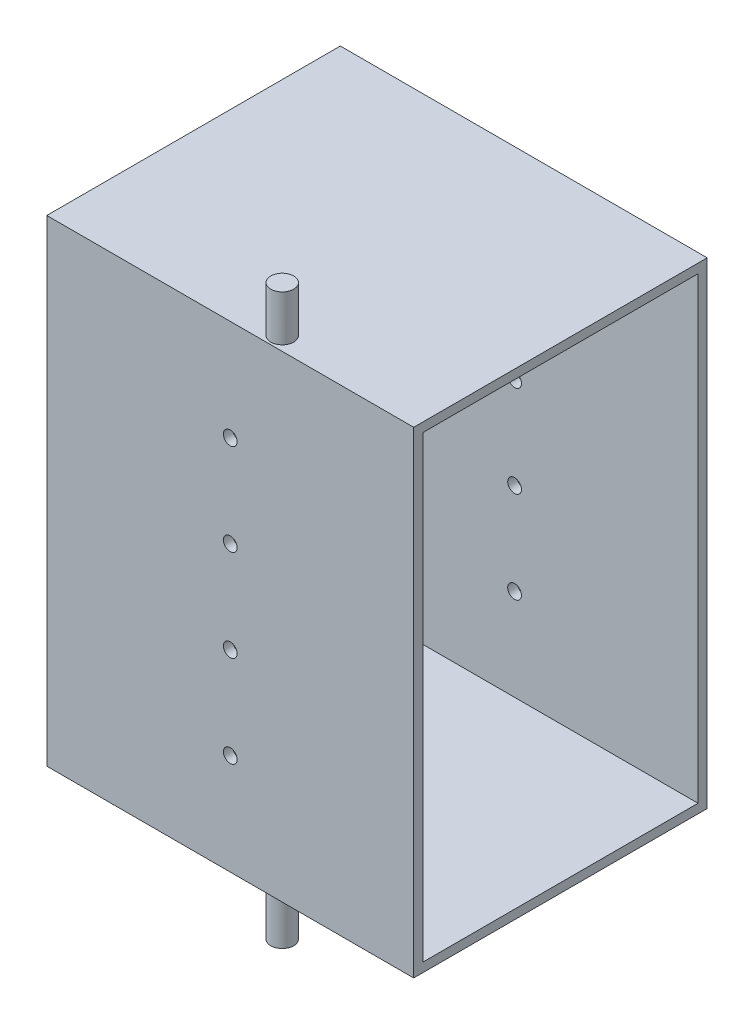
ISO-10303-21;
HEADER;
FILE_DESCRIPTION(('STEP AP214'),'2;1');
FILE_NAME('part.step','',(''),(''),'','','');
FILE_SCHEMA(('AUTOMOTIVE_DESIGN { 1 0 10303 214 1 1 1 1 }'));
ENDSEC;
DATA;
#1=APPLICATION_CONTEXT('core data for automotive mechanical design processes');
#2=APPLICATION_PROTOCOL_DEFINITION('international standard','automotive_design',2000,#1);
#3=PRODUCT_CONTEXT('',#1,'mechanical');
#4=PRODUCT('Part','Part','',(#3));
#5=PRODUCT_RELATED_PRODUCT_CATEGORY('part','',(#4));
#6=PRODUCT_DEFINITION_FORMATION('','',#4);
#7=PRODUCT_DEFINITION_CONTEXT('part definition',#1,'design');
#8=PRODUCT_DEFINITION('design','',#6,#7);
#9=PRODUCT_DEFINITION_SHAPE('','',#8);
#10=(LENGTH_UNIT() NAMED_UNIT(*) SI_UNIT(.MILLI.,.METRE.));
#11=(NAMED_UNIT(*) PLANE_ANGLE_UNIT() SI_UNIT($,.RADIAN.));
#12=(NAMED_UNIT(*) SI_UNIT($,.STERADIAN.) SOLID_ANGLE_UNIT());
#13=UNCERTAINTY_MEASURE_WITH_UNIT(LENGTH_MEASURE(1.E-05),#10,'distance_accuracy_value','');
#14=(GEOMETRIC_REPRESENTATION_CONTEXT(3) GLOBAL_UNCERTAINTY_ASSIGNED_CONTEXT((#13)) GLOBAL_UNIT_ASSIGNED_CONTEXT((#10,
#11,#12)) REPRESENTATION_CONTEXT('',''));
#15=CARTESIAN_POINT('',(0.,0.,0.));
#16=DIRECTION('',(0.,0.,1.));
#17=DIRECTION('',(1.,0.,0.));
#18=AXIS2_PLACEMENT_3D('',#15,#16,#17);
#19=CARTESIAN_POINT('',(98.,90.,32.));
#20=DIRECTION('',(0.,0.,-1.));
#21=DIRECTION('',(-1.,0.,0.));
#22=AXIS2_PLACEMENT_3D('',#19,#20,#21);
#23=PLANE('',#22);
#24=CARTESIAN_POINT('',(58.,110.,32.));
#25=DIRECTION('',(0.,0.,1.));
#26=DIRECTION('',(1.,0.,0.));
#27=AXIS2_PLACEMENT_3D('',#24,#25,#26);
#28=CIRCLE('',#27,1.5);
#29=CARTESIAN_POINT('',(59.5,110.,32.));
#30=VERTEX_POINT('',#29);
#31=EDGE_CURVE('E293',#30,#30,#28,.T.);
#32=ORIENTED_EDGE('',*,*,#31,.F.);
#33=EDGE_LOOP('',(#32));
#34=FACE_BOUND('',#33,.T.);
#35=CARTESIAN_POINT('',(58.,130.,32.));
#36=DIRECTION('',(0.,0.,1.));
#37=DIRECTION('',(1.,0.,0.));
#38=AXIS2_PLACEMENT_3D('',#35,#36,#37);
#39=CIRCLE('',#38,1.5);
#40=CARTESIAN_POINT('',(59.5,130.,32.));
#41=VERTEX_POINT('',#40);
#42=EDGE_CURVE('E296',#41,#41,#39,.T.);
#43=ORIENTED_EDGE('',*,*,#42,.F.);
#44=EDGE_LOOP('',(#43));
#45=FACE_BOUND('',#44,.T.);
#46=CARTESIAN_POINT('',(58.,150.,32.));
#47=DIRECTION('',(0.,0.,1.));
#48=DIRECTION('',(1.,0.,0.));
#49=AXIS2_PLACEMENT_3D('',#46,#47,#48);
#50=CIRCLE('',#49,1.5);
#51=CARTESIAN_POINT('',(59.5,150.,32.));
#52=VERTEX_POINT('',#51);
#53=EDGE_CURVE('E301',#52,#52,#50,.T.);
#54=ORIENTED_EDGE('',*,*,#53,.F.);
#55=EDGE_LOOP('',(#54));
#56=FACE_BOUND('',#55,.T.);
#57=CARTESIAN_POINT('',(58.,170.,32.));
#58=DIRECTION('',(0.,0.,1.));
#59=DIRECTION('',(1.,0.,0.));
#60=AXIS2_PLACEMENT_3D('',#57,#58,#59);
#61=CIRCLE('',#60,1.5);
#62=CARTESIAN_POINT('',(59.5,170.,32.));
#63=VERTEX_POINT('',#62);
#64=EDGE_CURVE('E307',#63,#63,#61,.T.);
#65=ORIENTED_EDGE('',*,*,#64,.F.);
#66=EDGE_LOOP('',(#65));
#67=FACE_BOUND('',#66,.T.);
#68=DIRECTION('',(0.,-1.,0.));
#69=VECTOR('',#68,1.);
#70=CARTESIAN_POINT('',(18.,90.,32.));
#71=LINE('',#70,#69);
#72=CARTESIAN_POINT('',(18.,192.,32.));
#73=VERTEX_POINT('',#72);
#74=CARTESIAN_POINT('',(18.,88.,32.));
#75=VERTEX_POINT('',#74);
#76=EDGE_CURVE('E123',#73,#75,#71,.T.);
#77=ORIENTED_EDGE('',*,*,#76,.T.);
#78=DIRECTION('',(-1.,0.,0.));
#79=VECTOR('',#78,1.);
#80=CARTESIAN_POINT('',(98.,88.,32.));
#81=LINE('',#80,#79);
#82=CARTESIAN_POINT('',(98.,88.,32.));
#83=VERTEX_POINT('',#82);
#84=EDGE_CURVE('E146',#83,#75,#81,.T.);
#85=ORIENTED_EDGE('',*,*,#84,.F.);
#86=DIRECTION('',(0.,-1.,0.));
#87=VECTOR('',#86,1.);
#88=CARTESIAN_POINT('',(98.,90.,32.));
#89=LINE('',#88,#87);
#90=CARTESIAN_POINT('',(98.,192.,32.));
#91=VERTEX_POINT('',#90);
#92=EDGE_CURVE('E164',#91,#83,#89,.T.);
#93=ORIENTED_EDGE('',*,*,#92,.F.);
#94=DIRECTION('',(-1.,0.,0.));
#95=VECTOR('',#94,1.);
#96=CARTESIAN_POINT('',(98.,192.,32.));
#97=LINE('',#96,#95);
#98=EDGE_CURVE('E150',#91,#73,#97,.T.);
#99=ORIENTED_EDGE('',*,*,#98,.T.);
#100=EDGE_LOOP('',(#77,#85,#93,#99));
#101=FACE_BOUND('',#100,.T.);
#102=ADVANCED_FACE('F39',(#34,#45,#56,#67,#101),#23,.F.);
#103=CARTESIAN_POINT('',(98.,88.,-30.));
#104=DIRECTION('',(0.,1.,0.));
#105=DIRECTION('',(0.,0.,1.));
#106=AXIS2_PLACEMENT_3D('',#103,#104,#105);
#107=PLANE('',#106);
#108=CARTESIAN_POINT('',(66.3422751481595,88.,29.));
#109=DIRECTION('',(0.,1.,0.));
#110=DIRECTION('',(0.,0.,1.));
#111=AXIS2_PLACEMENT_3D('',#108,#109,#110);
#112=CIRCLE('',#111,2.5);
#113=CARTESIAN_POINT('',(66.3422751481595,88.,31.5));
#114=VERTEX_POINT('',#113);
#115=EDGE_CURVE('E11',#114,#114,#112,.F.);
#116=ORIENTED_EDGE('',*,*,#115,.F.);
#117=EDGE_LOOP('',(#116));
#118=FACE_BOUND('',#117,.T.);
#119=DIRECTION('',(0.,0.,-1.));
#120=VECTOR('',#119,1.);
#121=CARTESIAN_POINT('',(18.,88.,-30.));
#122=LINE('',#121,#120);
#123=CARTESIAN_POINT('',(18.,88.,-32.));
#124=VERTEX_POINT('',#123);
#125=EDGE_CURVE('E161',#75,#124,#122,.T.);
#126=ORIENTED_EDGE('',*,*,#125,.T.);
#127=DIRECTION('',(-1.,0.,0.));
#128=VECTOR('',#127,1.);
#129=CARTESIAN_POINT('',(98.,88.,-32.));
#130=LINE('',#129,#128);
#131=CARTESIAN_POINT('',(98.,88.,-32.));
#132=VERTEX_POINT('',#131);
#133=EDGE_CURVE('E149',#132,#124,#130,.T.);
#134=ORIENTED_EDGE('',*,*,#133,.F.);
#135=DIRECTION('',(0.,0.,-1.));
#136=VECTOR('',#135,1.);
#137=CARTESIAN_POINT('',(98.,88.,-30.));
#138=LINE('',#137,#136);
#139=EDGE_CURVE('E170',#83,#132,#138,.T.);
#140=ORIENTED_EDGE('',*,*,#139,.F.);
#141=ORIENTED_EDGE('',*,*,#84,.T.);
#142=EDGE_LOOP('',(#126,#134,#140,#141));
#143=FACE_BOUND('',#142,.T.);
#144=ADVANCED_FACE('F211',(#118,#143),#107,.F.);
#145=CARTESIAN_POINT('',(98.,90.,-32.));
#146=DIRECTION('',(0.,0.,1.));
#147=DIRECTION('',(1.,0.,0.));
#148=AXIS2_PLACEMENT_3D('',#145,#146,#147);
#149=PLANE('',#148);
#150=CARTESIAN_POINT('',(58.,110.,-32.));
#151=DIRECTION('',(0.,0.,1.));
#152=DIRECTION('',(1.,0.,0.));
#153=AXIS2_PLACEMENT_3D('',#150,#151,#152);
#154=CIRCLE('',#153,1.5);
#155=CARTESIAN_POINT('',(59.5,110.,-32.));
#156=VERTEX_POINT('',#155);
#157=EDGE_CURVE('E179',#156,#156,#154,.T.);
#158=ORIENTED_EDGE('',*,*,#157,.T.);
#159=EDGE_LOOP('',(#158));
#160=FACE_BOUND('',#159,.T.);
#161=CARTESIAN_POINT('',(58.,130.,-32.));
#162=DIRECTION('',(0.,0.,1.));
#163=DIRECTION('',(1.,0.,0.));
#164=AXIS2_PLACEMENT_3D('',#161,#162,#163);
#165=CIRCLE('',#164,1.5);
#166=CARTESIAN_POINT('',(59.5,130.,-32.));
#167=VERTEX_POINT('',#166);
#168=EDGE_CURVE('E298',#167,#167,#165,.T.);
#169=ORIENTED_EDGE('',*,*,#168,.T.);
#170=EDGE_LOOP('',(#169));
#171=FACE_BOUND('',#170,.T.);
#172=CARTESIAN_POINT('',(58.,150.,-32.));
#173=DIRECTION('',(0.,0.,1.));
#174=DIRECTION('',(1.,0.,0.));
#175=AXIS2_PLACEMENT_3D('',#172,#173,#174);
#176=CIRCLE('',#175,1.5);
#177=CARTESIAN_POINT('',(59.5,150.,-32.));
#178=VERTEX_POINT('',#177);
#179=EDGE_CURVE('E304',#178,#178,#176,.T.);
#180=ORIENTED_EDGE('',*,*,#179,.T.);
#181=EDGE_LOOP('',(#180));
#182=FACE_BOUND('',#181,.T.);
#183=CARTESIAN_POINT('',(58.,170.,-32.));
#184=DIRECTION('',(0.,0.,1.));
#185=DIRECTION('',(1.,0.,0.));
#186=AXIS2_PLACEMENT_3D('',#183,#184,#185);
#187=CIRCLE('',#186,1.5);
#188=CARTESIAN_POINT('',(59.5,170.,-32.));
#189=VERTEX_POINT('',#188);
#190=EDGE_CURVE('E290',#189,#189,#187,.T.);
#191=ORIENTED_EDGE('',*,*,#190,.T.);
#192=EDGE_LOOP('',(#191));
#193=FACE_BOUND('',#192,.T.);
#194=DIRECTION('',(0.,1.,0.));
#195=VECTOR('',#194,1.);
#196=CARTESIAN_POINT('',(18.,90.,-32.));
#197=LINE('',#196,#195);
#198=CARTESIAN_POINT('',(18.,192.,-32.));
#199=VERTEX_POINT('',#198);
#200=EDGE_CURVE('E165',#124,#199,#197,.T.);
#201=ORIENTED_EDGE('',*,*,#200,.T.);
#202=DIRECTION('',(-1.,0.,0.));
#203=VECTOR('',#202,1.);
#204=CARTESIAN_POINT('',(98.,192.,-32.));
#205=LINE('',#204,#203);
#206=CARTESIAN_POINT('',(98.,192.,-32.));
#207=VERTEX_POINT('',#206);
#208=EDGE_CURVE('E153',#207,#199,#205,.T.);
#209=ORIENTED_EDGE('',*,*,#208,.F.);
#210=DIRECTION('',(0.,1.,0.));
#211=VECTOR('',#210,1.);
#212=CARTESIAN_POINT('',(98.,90.,-32.));
#213=LINE('',#212,#211);
#214=EDGE_CURVE('E172',#132,#207,#213,.T.);
#215=ORIENTED_EDGE('',*,*,#214,.F.);
#216=ORIENTED_EDGE('',*,*,#133,.T.);
#217=EDGE_LOOP('',(#201,#209,#215,#216));
#218=FACE_BOUND('',#217,.T.);
#219=ADVANCED_FACE('F197',(#160,#171,#182,#193,#218),#149,.F.);
#220=CARTESIAN_POINT('',(98.,192.,-30.));
#221=DIRECTION('',(0.,-1.,0.));
#222=DIRECTION('',(0.,0.,-1.));
#223=AXIS2_PLACEMENT_3D('',#220,#221,#222);
#224=PLANE('',#223);
#225=CARTESIAN_POINT('',(66.3422751481595,192.,29.));
#226=DIRECTION('',(0.,-1.,0.));
#227=DIRECTION('',(0.,0.,-1.));
#228=AXIS2_PLACEMENT_3D('',#225,#226,#227);
#229=CIRCLE('',#228,2.5);
#230=CARTESIAN_POINT('',(66.3422751481595,192.,26.5));
#231=VERTEX_POINT('',#230);
#232=EDGE_CURVE('E47',#231,#231,#229,.F.);
#233=ORIENTED_EDGE('',*,*,#232,.F.);
#234=EDGE_LOOP('',(#233));
#235=FACE_BOUND('',#234,.T.);
#236=DIRECTION('',(0.,0.,1.));
#237=VECTOR('',#236,1.);
#238=CARTESIAN_POINT('',(18.,192.,-30.));
#239=LINE('',#238,#237);
#240=EDGE_CURVE('E162',#199,#73,#239,.T.);
#241=ORIENTED_EDGE('',*,*,#240,.T.);
#242=ORIENTED_EDGE('',*,*,#98,.F.);
#243=DIRECTION('',(0.,0.,1.));
#244=VECTOR('',#243,1.);
#245=CARTESIAN_POINT('',(98.,192.,-30.));
#246=LINE('',#245,#244);
#247=EDGE_CURVE('E154',#207,#91,#246,.T.);
#248=ORIENTED_EDGE('',*,*,#247,.F.);
#249=ORIENTED_EDGE('',*,*,#208,.T.);
#250=EDGE_LOOP('',(#241,#242,#248,#249));
#251=FACE_BOUND('',#250,.T.);
#252=ADVANCED_FACE('F41',(#235,#251),#224,.F.);
#253=CARTESIAN_POINT('',(98.,0.,0.));
#254=DIRECTION('',(1.,0.,0.));
#255=DIRECTION('',(0.,0.,-1.));
#256=AXIS2_PLACEMENT_3D('',#253,#254,#255);
#257=PLANE('',#256);
#258=DIRECTION('',(0.,-1.,0.));
#259=VECTOR('',#258,1.);
#260=CARTESIAN_POINT('',(98.,90.,30.));
#261=LINE('',#260,#259);
#262=CARTESIAN_POINT('',(98.,190.,30.));
#263=VERTEX_POINT('',#262);
#264=CARTESIAN_POINT('',(98.,90.,30.));
#265=VERTEX_POINT('',#264);
#266=EDGE_CURVE('E106',#263,#265,#261,.T.);
#267=ORIENTED_EDGE('',*,*,#266,.F.);
#268=DIRECTION('',(0.,0.,1.));
#269=VECTOR('',#268,1.);
#270=CARTESIAN_POINT('',(98.,190.,-30.));
#271=LINE('',#270,#269);
#272=CARTESIAN_POINT('',(98.,190.,-30.));
#273=VERTEX_POINT('',#272);
#274=EDGE_CURVE('E131',#273,#263,#271,.T.);
#275=ORIENTED_EDGE('',*,*,#274,.F.);
#276=DIRECTION('',(0.,1.,0.));
#277=VECTOR('',#276,1.);
#278=CARTESIAN_POINT('',(98.,90.,-30.));
#279=LINE('',#278,#277);
#280=CARTESIAN_POINT('',(98.,90.,-30.));
#281=VERTEX_POINT('',#280);
#282=EDGE_CURVE('E129',#281,#273,#279,.T.);
#283=ORIENTED_EDGE('',*,*,#282,.F.);
#284=DIRECTION('',(0.,0.,-1.));
#285=VECTOR('',#284,1.);
#286=CARTESIAN_POINT('',(98.,90.,-30.));
#287=LINE('',#286,#285);
#288=EDGE_CURVE('E116',#265,#281,#287,.T.);
#289=ORIENTED_EDGE('',*,*,#288,.F.);
#290=EDGE_LOOP('',(#267,#275,#283,#289));
#291=FACE_BOUND('',#290,.T.);
#292=ORIENTED_EDGE('',*,*,#92,.T.);
#293=ORIENTED_EDGE('',*,*,#139,.T.);
#294=ORIENTED_EDGE('',*,*,#214,.T.);
#295=ORIENTED_EDGE('',*,*,#247,.T.);
#296=EDGE_LOOP('',(#292,#293,#294,#295));
#297=FACE_BOUND('',#296,.T.);
#298=ADVANCED_FACE('F127',(#291,#297),#257,.T.);
#299=CARTESIAN_POINT('',(18.,0.,0.));
#300=DIRECTION('',(1.,0.,0.));
#301=DIRECTION('',(0.,0.,-1.));
#302=AXIS2_PLACEMENT_3D('',#299,#300,#301);
#303=PLANE('',#302);
#304=DIRECTION('',(0.,0.,1.));
#305=VECTOR('',#304,1.);
#306=CARTESIAN_POINT('',(18.,190.,-30.));
#307=LINE('',#306,#305);
#308=CARTESIAN_POINT('',(18.,190.,-30.));
#309=VERTEX_POINT('',#308);
#310=CARTESIAN_POINT('',(18.,190.,30.));
#311=VERTEX_POINT('',#310);
#312=EDGE_CURVE('E117',#309,#311,#307,.T.);
#313=ORIENTED_EDGE('',*,*,#312,.T.);
#314=DIRECTION('',(0.,-1.,0.));
#315=VECTOR('',#314,1.);
#316=CARTESIAN_POINT('',(18.,90.,30.));
#317=LINE('',#316,#315);
#318=CARTESIAN_POINT('',(18.,90.,30.));
#319=VERTEX_POINT('',#318);
#320=EDGE_CURVE('E136',#311,#319,#317,.T.);
#321=ORIENTED_EDGE('',*,*,#320,.T.);
#322=DIRECTION('',(0.,0.,-1.));
#323=VECTOR('',#322,1.);
#324=CARTESIAN_POINT('',(18.,90.,-30.));
#325=LINE('',#324,#323);
#326=CARTESIAN_POINT('',(18.,90.,-30.));
#327=VERTEX_POINT('',#326);
#328=EDGE_CURVE('E122',#319,#327,#325,.T.);
#329=ORIENTED_EDGE('',*,*,#328,.T.);
#330=DIRECTION('',(0.,1.,0.));
#331=VECTOR('',#330,1.);
#332=CARTESIAN_POINT('',(18.,90.,-30.));
#333=LINE('',#332,#331);
#334=EDGE_CURVE('E61',#327,#309,#333,.T.);
#335=ORIENTED_EDGE('',*,*,#334,.T.);
#336=EDGE_LOOP('',(#313,#321,#329,#335));
#337=FACE_BOUND('',#336,.T.);
#338=ORIENTED_EDGE('',*,*,#76,.F.);
#339=ORIENTED_EDGE('',*,*,#240,.F.);
#340=ORIENTED_EDGE('',*,*,#200,.F.);
#341=ORIENTED_EDGE('',*,*,#125,.F.);
#342=EDGE_LOOP('',(#338,#339,#340,#341));
#343=FACE_BOUND('',#342,.T.);
#344=ADVANCED_FACE('F208',(#337,#343),#303,.F.);
#345=CARTESIAN_POINT('',(98.,90.,30.));
#346=DIRECTION('',(0.,0.,-1.));
#347=DIRECTION('',(-1.,0.,0.));
#348=AXIS2_PLACEMENT_3D('',#345,#346,#347);
#349=PLANE('',#348);
#350=CARTESIAN_POINT('',(58.,110.,30.));
#351=DIRECTION('',(0.,0.,-1.));
#352=DIRECTION('',(-1.,0.,0.));
#353=AXIS2_PLACEMENT_3D('',#350,#351,#352);
#354=CIRCLE('',#353,1.5);
#355=CARTESIAN_POINT('',(56.5,110.,30.));
#356=VERTEX_POINT('',#355);
#357=EDGE_CURVE('E138',#356,#356,#354,.T.);
#358=ORIENTED_EDGE('',*,*,#357,.F.);
#359=EDGE_LOOP('',(#358));
#360=FACE_BOUND('',#359,.T.);
#361=CARTESIAN_POINT('',(58.,130.,30.));
#362=DIRECTION('',(0.,0.,-1.));
#363=DIRECTION('',(-1.,0.,0.));
#364=AXIS2_PLACEMENT_3D('',#361,#362,#363);
#365=CIRCLE('',#364,1.5);
#366=CARTESIAN_POINT('',(56.5,130.,30.));
#367=VERTEX_POINT('',#366);
#368=EDGE_CURVE('E187',#367,#367,#365,.T.);
#369=ORIENTED_EDGE('',*,*,#368,.F.);
#370=EDGE_LOOP('',(#369));
#371=FACE_BOUND('',#370,.T.);
#372=CARTESIAN_POINT('',(58.,150.,30.));
#373=DIRECTION('',(0.,0.,-1.));
#374=DIRECTION('',(-1.,0.,0.));
#375=AXIS2_PLACEMENT_3D('',#372,#373,#374);
#376=CIRCLE('',#375,1.5);
#377=CARTESIAN_POINT('',(56.5,150.,30.));
#378=VERTEX_POINT('',#377);
#379=EDGE_CURVE('E183',#378,#378,#376,.T.);
#380=ORIENTED_EDGE('',*,*,#379,.F.);
#381=EDGE_LOOP('',(#380));
#382=FACE_BOUND('',#381,.T.);
#383=CARTESIAN_POINT('',(58.,170.,30.));
#384=DIRECTION('',(0.,0.,-1.));
#385=DIRECTION('',(-1.,0.,0.));
#386=AXIS2_PLACEMENT_3D('',#383,#384,#385);
#387=CIRCLE('',#386,1.5);
#388=CARTESIAN_POINT('',(56.5,170.,30.));
#389=VERTEX_POINT('',#388);
#390=EDGE_CURVE('E178',#389,#389,#387,.T.);
#391=ORIENTED_EDGE('',*,*,#390,.F.);
#392=EDGE_LOOP('',(#391));
#393=FACE_BOUND('',#392,.T.);
#394=ORIENTED_EDGE('',*,*,#320,.F.);
#395=DIRECTION('',(-1.,0.,0.));
#396=VECTOR('',#395,1.);
#397=CARTESIAN_POINT('',(98.,190.,30.));
#398=LINE('',#397,#396);
#399=EDGE_CURVE('E112',#263,#311,#398,.T.);
#400=ORIENTED_EDGE('',*,*,#399,.F.);
#401=ORIENTED_EDGE('',*,*,#266,.T.);
#402=DIRECTION('',(-1.,0.,0.));
#403=VECTOR('',#402,1.);
#404=CARTESIAN_POINT('',(98.,90.,30.));
#405=LINE('',#404,#403);
#406=EDGE_CURVE('E110',#265,#319,#405,.T.);
#407=ORIENTED_EDGE('',*,*,#406,.T.);
#408=EDGE_LOOP('',(#394,#400,#401,#407));
#409=FACE_BOUND('',#408,.T.);
#410=ADVANCED_FACE('F109',(#360,#371,#382,#393,#409),#349,.T.);
#411=CARTESIAN_POINT('',(98.,90.,-30.));
#412=DIRECTION('',(0.,1.,0.));
#413=DIRECTION('',(0.,0.,1.));
#414=AXIS2_PLACEMENT_3D('',#411,#412,#413);
#415=PLANE('',#414);
#416=ORIENTED_EDGE('',*,*,#328,.F.);
#417=ORIENTED_EDGE('',*,*,#406,.F.);
#418=ORIENTED_EDGE('',*,*,#288,.T.);
#419=DIRECTION('',(-1.,0.,0.));
#420=VECTOR('',#419,1.);
#421=CARTESIAN_POINT('',(98.,90.,-30.));
#422=LINE('',#421,#420);
#423=EDGE_CURVE('E124',#281,#327,#422,.T.);
#424=ORIENTED_EDGE('',*,*,#423,.T.);
#425=EDGE_LOOP('',(#416,#417,#418,#424));
#426=FACE_BOUND('',#425,.T.);
#427=ADVANCED_FACE('F120',(#426),#415,.T.);
#428=CARTESIAN_POINT('',(98.,90.,-30.));
#429=DIRECTION('',(0.,0.,1.));
#430=DIRECTION('',(1.,0.,0.));
#431=AXIS2_PLACEMENT_3D('',#428,#429,#430);
#432=PLANE('',#431);
#433=CARTESIAN_POINT('',(58.,110.,-30.));
#434=DIRECTION('',(0.,0.,1.));
#435=DIRECTION('',(1.,0.,0.));
#436=AXIS2_PLACEMENT_3D('',#433,#434,#435);
#437=CIRCLE('',#436,1.5);
#438=CARTESIAN_POINT('',(59.5,110.,-30.));
#439=VERTEX_POINT('',#438);
#440=EDGE_CURVE('E188',#439,#439,#437,.T.);
#441=ORIENTED_EDGE('',*,*,#440,.F.);
#442=EDGE_LOOP('',(#441));
#443=FACE_BOUND('',#442,.T.);
#444=CARTESIAN_POINT('',(58.,130.,-30.));
#445=DIRECTION('',(0.,0.,1.));
#446=DIRECTION('',(1.,0.,0.));
#447=AXIS2_PLACEMENT_3D('',#444,#445,#446);
#448=CIRCLE('',#447,1.5);
#449=CARTESIAN_POINT('',(59.5,130.,-30.));
#450=VERTEX_POINT('',#449);
#451=EDGE_CURVE('E184',#450,#450,#448,.T.);
#452=ORIENTED_EDGE('',*,*,#451,.F.);
#453=EDGE_LOOP('',(#452));
#454=FACE_BOUND('',#453,.T.);
#455=CARTESIAN_POINT('',(58.,150.,-30.));
#456=DIRECTION('',(0.,0.,1.));
#457=DIRECTION('',(1.,0.,0.));
#458=AXIS2_PLACEMENT_3D('',#455,#456,#457);
#459=CIRCLE('',#458,1.5);
#460=CARTESIAN_POINT('',(59.5,150.,-30.));
#461=VERTEX_POINT('',#460);
#462=EDGE_CURVE('E180',#461,#461,#459,.T.);
#463=ORIENTED_EDGE('',*,*,#462,.F.);
#464=EDGE_LOOP('',(#463));
#465=FACE_BOUND('',#464,.T.);
#466=CARTESIAN_POINT('',(58.,170.,-30.));
#467=DIRECTION('',(0.,0.,1.));
#468=DIRECTION('',(1.,0.,0.));
#469=AXIS2_PLACEMENT_3D('',#466,#467,#468);
#470=CIRCLE('',#469,1.5);
#471=CARTESIAN_POINT('',(59.5,170.,-30.));
#472=VERTEX_POINT('',#471);
#473=EDGE_CURVE('E175',#472,#472,#470,.T.);
#474=ORIENTED_EDGE('',*,*,#473,.F.);
#475=EDGE_LOOP('',(#474));
#476=FACE_BOUND('',#475,.T.);
#477=ORIENTED_EDGE('',*,*,#334,.F.);
#478=ORIENTED_EDGE('',*,*,#423,.F.);
#479=ORIENTED_EDGE('',*,*,#282,.T.);
#480=DIRECTION('',(-1.,0.,0.));
#481=VECTOR('',#480,1.);
#482=CARTESIAN_POINT('',(98.,190.,-30.));
#483=LINE('',#482,#481);
#484=EDGE_CURVE('E54',#273,#309,#483,.T.);
#485=ORIENTED_EDGE('',*,*,#484,.T.);
#486=EDGE_LOOP('',(#477,#478,#479,#485));
#487=FACE_BOUND('',#486,.T.);
#488=ADVANCED_FACE('F242',(#443,#454,#465,#476,#487),#432,.T.);
#489=CARTESIAN_POINT('',(98.,190.,-30.));
#490=DIRECTION('',(0.,-1.,0.));
#491=DIRECTION('',(0.,0.,-1.));
#492=AXIS2_PLACEMENT_3D('',#489,#490,#491);
#493=PLANE('',#492);
#494=ORIENTED_EDGE('',*,*,#312,.F.);
#495=ORIENTED_EDGE('',*,*,#484,.F.);
#496=ORIENTED_EDGE('',*,*,#274,.T.);
#497=ORIENTED_EDGE('',*,*,#399,.T.);
#498=EDGE_LOOP('',(#494,#495,#496,#497));
#499=FACE_BOUND('',#498,.T.);
#500=ADVANCED_FACE('F245',(#499),#493,.T.);
#501=CARTESIAN_POINT('',(58.,170.,-32.));
#502=DIRECTION('',(0.,0.,1.));
#503=DIRECTION('',(1.,0.,0.));
#504=AXIS2_PLACEMENT_3D('',#501,#502,#503);
#505=CYLINDRICAL_SURFACE('',#504,1.5);
#506=ORIENTED_EDGE('',*,*,#473,.T.);
#507=EDGE_LOOP('',(#506));
#508=FACE_BOUND('',#507,.T.);
#509=ORIENTED_EDGE('',*,*,#190,.F.);
#510=EDGE_LOOP('',(#509));
#511=FACE_BOUND('',#510,.T.);
#512=ADVANCED_FACE('F248',(#508,#511),#505,.F.);
#513=CARTESIAN_POINT('',(58.,150.,-32.));
#514=DIRECTION('',(0.,0.,1.));
#515=DIRECTION('',(1.,0.,0.));
#516=AXIS2_PLACEMENT_3D('',#513,#514,#515);
#517=CYLINDRICAL_SURFACE('',#516,1.5);
#518=ORIENTED_EDGE('',*,*,#462,.T.);
#519=EDGE_LOOP('',(#518));
#520=FACE_BOUND('',#519,.T.);
#521=ORIENTED_EDGE('',*,*,#179,.F.);
#522=EDGE_LOOP('',(#521));
#523=FACE_BOUND('',#522,.T.);
#524=ADVANCED_FACE('F251',(#520,#523),#517,.F.);
#525=CARTESIAN_POINT('',(58.,130.,-32.));
#526=DIRECTION('',(0.,0.,1.));
#527=DIRECTION('',(1.,0.,0.));
#528=AXIS2_PLACEMENT_3D('',#525,#526,#527);
#529=CYLINDRICAL_SURFACE('',#528,1.5);
#530=ORIENTED_EDGE('',*,*,#451,.T.);
#531=EDGE_LOOP('',(#530));
#532=FACE_BOUND('',#531,.T.);
#533=ORIENTED_EDGE('',*,*,#168,.F.);
#534=EDGE_LOOP('',(#533));
#535=FACE_BOUND('',#534,.T.);
#536=ADVANCED_FACE('F256',(#532,#535),#529,.F.);
#537=CARTESIAN_POINT('',(58.,110.,-32.));
#538=DIRECTION('',(0.,0.,1.));
#539=DIRECTION('',(1.,0.,0.));
#540=AXIS2_PLACEMENT_3D('',#537,#538,#539);
#541=CYLINDRICAL_SURFACE('',#540,1.5);
#542=ORIENTED_EDGE('',*,*,#440,.T.);
#543=EDGE_LOOP('',(#542));
#544=FACE_BOUND('',#543,.T.);
#545=ORIENTED_EDGE('',*,*,#157,.F.);
#546=EDGE_LOOP('',(#545));
#547=FACE_BOUND('',#546,.T.);
#548=ADVANCED_FACE('F261',(#544,#547),#541,.F.);
#549=ORIENTED_EDGE('',*,*,#390,.T.);
#550=EDGE_LOOP('',(#549));
#551=FACE_BOUND('',#550,.T.);
#552=ORIENTED_EDGE('',*,*,#64,.T.);
#553=EDGE_LOOP('',(#552));
#554=FACE_BOUND('',#553,.T.);
#555=ADVANCED_FACE('F253',(#551,#554),#505,.F.);
#556=ORIENTED_EDGE('',*,*,#379,.T.);
#557=EDGE_LOOP('',(#556));
#558=FACE_BOUND('',#557,.T.);
#559=ORIENTED_EDGE('',*,*,#53,.T.);
#560=EDGE_LOOP('',(#559));
#561=FACE_BOUND('',#560,.T.);
#562=ADVANCED_FACE('F258',(#558,#561),#517,.F.);
#563=ORIENTED_EDGE('',*,*,#368,.T.);
#564=EDGE_LOOP('',(#563));
#565=FACE_BOUND('',#564,.T.);
#566=ORIENTED_EDGE('',*,*,#42,.T.);
#567=EDGE_LOOP('',(#566));
#568=FACE_BOUND('',#567,.T.);
#569=ADVANCED_FACE('F263',(#565,#568),#529,.F.);
#570=ORIENTED_EDGE('',*,*,#357,.T.);
#571=EDGE_LOOP('',(#570));
#572=FACE_BOUND('',#571,.T.);
#573=ORIENTED_EDGE('',*,*,#31,.T.);
#574=EDGE_LOOP('',(#573));
#575=FACE_BOUND('',#574,.T.);
#576=ADVANCED_FACE('F267',(#572,#575),#541,.F.);
#577=CARTESIAN_POINT('',(66.3422751481595,202.,29.));
#578=DIRECTION('',(0.,-1.,0.));
#579=DIRECTION('',(0.,0.,-1.));
#580=AXIS2_PLACEMENT_3D('',#577,#578,#579);
#581=CYLINDRICAL_SURFACE('',#580,2.5);
#582=CARTESIAN_POINT('',(66.3422751481595,202.,29.));
#583=DIRECTION('',(0.,1.,0.));
#584=DIRECTION('',(0.,0.,1.));
#585=AXIS2_PLACEMENT_3D('',#582,#583,#584);
#586=CIRCLE('',#585,2.5);
#587=CARTESIAN_POINT('',(66.3422751481595,202.,31.5));
#588=VERTEX_POINT('',#587);
#589=EDGE_CURVE('E287',#588,#588,#586,.T.);
#590=ORIENTED_EDGE('',*,*,#589,.F.);
#591=EDGE_LOOP('',(#590));
#592=FACE_BOUND('',#591,.T.);
#593=ORIENTED_EDGE('',*,*,#232,.T.);
#594=EDGE_LOOP('',(#593));
#595=FACE_BOUND('',#594,.T.);
#596=ADVANCED_FACE('F193',(#592,#595),#581,.T.);
#597=CARTESIAN_POINT('',(66.3422751481595,202.,29.));
#598=DIRECTION('',(0.,1.,0.));
#599=DIRECTION('',(0.,0.,1.));
#600=AXIS2_PLACEMENT_3D('',#597,#598,#599);
#601=PLANE('',#600);
#602=ORIENTED_EDGE('',*,*,#589,.T.);
#603=EDGE_LOOP('',(#602));
#604=FACE_BOUND('',#603,.T.);
#605=ADVANCED_FACE('F270',(#604),#601,.T.);
#606=CARTESIAN_POINT('',(66.3422751481595,78.,29.));
#607=DIRECTION('',(0.,1.,0.));
#608=DIRECTION('',(0.,0.,1.));
#609=AXIS2_PLACEMENT_3D('',#606,#607,#608);
#610=CYLINDRICAL_SURFACE('',#609,2.5);
#611=CARTESIAN_POINT('',(66.3422751481595,78.,29.));
#612=DIRECTION('',(0.,-1.,0.));
#613=DIRECTION('',(0.,0.,-1.));
#614=AXIS2_PLACEMENT_3D('',#611,#612,#613);
#615=CIRCLE('',#614,2.5);
#616=CARTESIAN_POINT('',(66.3422751481595,78.,26.5));
#617=VERTEX_POINT('',#616);
#618=EDGE_CURVE('E286',#617,#617,#615,.T.);
#619=ORIENTED_EDGE('',*,*,#618,.F.);
#620=EDGE_LOOP('',(#619));
#621=FACE_BOUND('',#620,.T.);
#622=ORIENTED_EDGE('',*,*,#115,.T.);
#623=EDGE_LOOP('',(#622));
#624=FACE_BOUND('',#623,.T.);
#625=ADVANCED_FACE('F274',(#621,#624),#610,.T.);
#626=CARTESIAN_POINT('',(66.3422751481595,78.,29.));
#627=DIRECTION('',(0.,-1.,0.));
#628=DIRECTION('',(0.,0.,-1.));
#629=AXIS2_PLACEMENT_3D('',#626,#627,#628);
#630=PLANE('',#629);
#631=ORIENTED_EDGE('',*,*,#618,.T.);
#632=EDGE_LOOP('',(#631));
#633=FACE_BOUND('',#632,.T.);
#634=ADVANCED_FACE('F278',(#633),#630,.T.);
#635=CLOSED_SHELL('',(#102,#144,#219,#252,#298,#344,#410,#427,#488,#500,#512,#524,#536,#548,
#555,#562,#569,#576,#596,#605,#625,#634));
#636=MANIFOLD_SOLID_BREP('B2',#635);
#637=ADVANCED_BREP_SHAPE_REPRESENTATION('',(#18,#636),#14);
#638=SHAPE_DEFINITION_REPRESENTATION(#9,#637);
ENDSEC;
END-ISO-10303-21;
